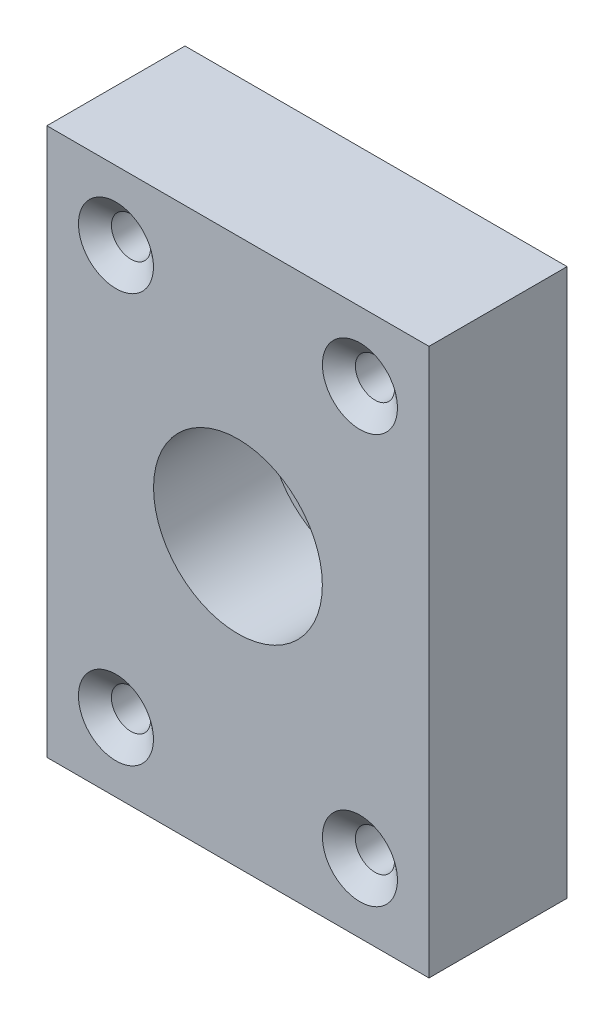
ISO-10303-21;
HEADER;
FILE_DESCRIPTION(('STEP AP214'),'2;1');
FILE_NAME('part.step','',(''),(''),'','','');
FILE_SCHEMA(('AUTOMOTIVE_DESIGN { 1 0 10303 214 1 1 1 1 }'));
ENDSEC;
DATA;
#1=APPLICATION_CONTEXT('core data for automotive mechanical design processes');
#2=APPLICATION_PROTOCOL_DEFINITION('international standard','automotive_design',2000,#1);
#3=PRODUCT_CONTEXT('',#1,'mechanical');
#4=PRODUCT('Part','Part','',(#3));
#5=PRODUCT_RELATED_PRODUCT_CATEGORY('part','',(#4));
#6=PRODUCT_DEFINITION_FORMATION('','',#4);
#7=PRODUCT_DEFINITION_CONTEXT('part definition',#1,'design');
#8=PRODUCT_DEFINITION('design','',#6,#7);
#9=PRODUCT_DEFINITION_SHAPE('','',#8);
#10=(LENGTH_UNIT() NAMED_UNIT(*) SI_UNIT(.MILLI.,.METRE.));
#11=(NAMED_UNIT(*) PLANE_ANGLE_UNIT() SI_UNIT($,.RADIAN.));
#12=(NAMED_UNIT(*) SI_UNIT($,.STERADIAN.) SOLID_ANGLE_UNIT());
#13=UNCERTAINTY_MEASURE_WITH_UNIT(LENGTH_MEASURE(1.E-05),#10,'distance_accuracy_value','');
#14=(GEOMETRIC_REPRESENTATION_CONTEXT(3) GLOBAL_UNCERTAINTY_ASSIGNED_CONTEXT((#13)) GLOBAL_UNIT_ASSIGNED_CONTEXT((#10,
#11,#12)) REPRESENTATION_CONTEXT('',''));
#15=CARTESIAN_POINT('',(0.,0.,0.));
#16=DIRECTION('',(0.,0.,1.));
#17=DIRECTION('',(1.,0.,0.));
#18=AXIS2_PLACEMENT_3D('',#15,#16,#17);
#19=CARTESIAN_POINT('',(0.,0.,18.));
#20=DIRECTION('',(1.,0.,0.));
#21=DIRECTION('',(0.,0.,-1.));
#22=AXIS2_PLACEMENT_3D('',#19,#20,#21);
#23=PLANE('',#22);
#24=DIRECTION('',(0.,-1.,0.));
#25=VECTOR('',#24,1.);
#26=CARTESIAN_POINT('',(0.,0.,0.));
#27=LINE('',#26,#25);
#28=CARTESIAN_POINT('',(0.,71.3,0.));
#29=VERTEX_POINT('',#28);
#30=CARTESIAN_POINT('',(0.,0.,0.));
#31=VERTEX_POINT('',#30);
#32=EDGE_CURVE('E96',#29,#31,#27,.T.);
#33=ORIENTED_EDGE('',*,*,#32,.T.);
#34=DIRECTION('',(0.,0.,-1.));
#35=VECTOR('',#34,1.);
#36=CARTESIAN_POINT('',(0.,0.,18.));
#37=LINE('',#36,#35);
#38=CARTESIAN_POINT('',(0.,0.,18.));
#39=VERTEX_POINT('',#38);
#40=EDGE_CURVE('E11',#39,#31,#37,.T.);
#41=ORIENTED_EDGE('',*,*,#40,.F.);
#42=DIRECTION('',(0.,-1.,0.));
#43=VECTOR('',#42,1.);
#44=CARTESIAN_POINT('',(0.,0.,18.));
#45=LINE('',#44,#43);
#46=CARTESIAN_POINT('',(0.,71.3,18.));
#47=VERTEX_POINT('',#46);
#48=EDGE_CURVE('E84',#47,#39,#45,.T.);
#49=ORIENTED_EDGE('',*,*,#48,.F.);
#50=DIRECTION('',(0.,0.,-1.));
#51=VECTOR('',#50,1.);
#52=CARTESIAN_POINT('',(0.,71.3,18.));
#53=LINE('',#52,#51);
#54=EDGE_CURVE('E92',#47,#29,#53,.T.);
#55=ORIENTED_EDGE('',*,*,#54,.T.);
#56=EDGE_LOOP('',(#33,#41,#49,#55));
#57=FACE_BOUND('',#56,.T.);
#58=ADVANCED_FACE('F33',(#57),#23,.F.);
#59=CARTESIAN_POINT('',(0.,0.,18.));
#60=DIRECTION('',(0.,1.,0.));
#61=DIRECTION('',(0.,0.,1.));
#62=AXIS2_PLACEMENT_3D('',#59,#60,#61);
#63=PLANE('',#62);
#64=DIRECTION('',(1.,0.,0.));
#65=VECTOR('',#64,1.);
#66=CARTESIAN_POINT('',(0.,0.,0.));
#67=LINE('',#66,#65);
#68=CARTESIAN_POINT('',(49.8,0.,0.));
#69=VERTEX_POINT('',#68);
#70=EDGE_CURVE('E88',#31,#69,#67,.T.);
#71=ORIENTED_EDGE('',*,*,#70,.T.);
#72=DIRECTION('',(0.,0.,-1.));
#73=VECTOR('',#72,1.);
#74=CARTESIAN_POINT('',(49.8,0.,18.));
#75=LINE('',#74,#73);
#76=CARTESIAN_POINT('',(49.8,0.,18.));
#77=VERTEX_POINT('',#76);
#78=EDGE_CURVE('E41',#77,#69,#75,.T.);
#79=ORIENTED_EDGE('',*,*,#78,.F.);
#80=DIRECTION('',(1.,0.,0.));
#81=VECTOR('',#80,1.);
#82=CARTESIAN_POINT('',(0.,0.,18.));
#83=LINE('',#82,#81);
#84=EDGE_CURVE('E79',#39,#77,#83,.T.);
#85=ORIENTED_EDGE('',*,*,#84,.F.);
#86=ORIENTED_EDGE('',*,*,#40,.T.);
#87=EDGE_LOOP('',(#71,#79,#85,#86));
#88=FACE_BOUND('',#87,.T.);
#89=ADVANCED_FACE('F87',(#88),#63,.F.);
#90=CARTESIAN_POINT('',(49.8,0.,18.));
#91=DIRECTION('',(-1.,0.,0.));
#92=DIRECTION('',(0.,0.,1.));
#93=AXIS2_PLACEMENT_3D('',#90,#91,#92);
#94=PLANE('',#93);
#95=DIRECTION('',(0.,1.,0.));
#96=VECTOR('',#95,1.);
#97=CARTESIAN_POINT('',(49.8,0.,0.));
#98=LINE('',#97,#96);
#99=CARTESIAN_POINT('',(49.8,71.3,0.));
#100=VERTEX_POINT('',#99);
#101=EDGE_CURVE('E66',#69,#100,#98,.T.);
#102=ORIENTED_EDGE('',*,*,#101,.T.);
#103=DIRECTION('',(0.,0.,-1.));
#104=VECTOR('',#103,1.);
#105=CARTESIAN_POINT('',(49.8,71.3,18.));
#106=LINE('',#105,#104);
#107=CARTESIAN_POINT('',(49.8,71.3,18.));
#108=VERTEX_POINT('',#107);
#109=EDGE_CURVE('E89',#108,#100,#106,.T.);
#110=ORIENTED_EDGE('',*,*,#109,.F.);
#111=DIRECTION('',(0.,1.,0.));
#112=VECTOR('',#111,1.);
#113=CARTESIAN_POINT('',(49.8,0.,18.));
#114=LINE('',#113,#112);
#115=EDGE_CURVE('E82',#77,#108,#114,.T.);
#116=ORIENTED_EDGE('',*,*,#115,.F.);
#117=ORIENTED_EDGE('',*,*,#78,.T.);
#118=EDGE_LOOP('',(#102,#110,#116,#117));
#119=FACE_BOUND('',#118,.T.);
#120=ADVANCED_FACE('F90',(#119),#94,.F.);
#121=CARTESIAN_POINT('',(0.,71.3,18.));
#122=DIRECTION('',(0.,-1.,0.));
#123=DIRECTION('',(0.,0.,-1.));
#124=AXIS2_PLACEMENT_3D('',#121,#122,#123);
#125=PLANE('',#124);
#126=DIRECTION('',(-1.,0.,0.));
#127=VECTOR('',#126,1.);
#128=CARTESIAN_POINT('',(0.,71.3,0.));
#129=LINE('',#128,#127);
#130=EDGE_CURVE('E72',#100,#29,#129,.T.);
#131=ORIENTED_EDGE('',*,*,#130,.T.);
#132=ORIENTED_EDGE('',*,*,#54,.F.);
#133=DIRECTION('',(-1.,0.,0.));
#134=VECTOR('',#133,1.);
#135=CARTESIAN_POINT('',(0.,71.3,18.));
#136=LINE('',#135,#134);
#137=EDGE_CURVE('E49',#108,#47,#136,.T.);
#138=ORIENTED_EDGE('',*,*,#137,.F.);
#139=ORIENTED_EDGE('',*,*,#109,.T.);
#140=EDGE_LOOP('',(#131,#132,#138,#139));
#141=FACE_BOUND('',#140,.T.);
#142=ADVANCED_FACE('F104',(#141),#125,.F.);
#143=CARTESIAN_POINT('',(0.,0.,18.));
#144=DIRECTION('',(0.,0.,-1.));
#145=DIRECTION('',(-1.,0.,0.));
#146=AXIS2_PLACEMENT_3D('',#143,#144,#145);
#147=PLANE('',#146);
#148=CARTESIAN_POINT('',(9.00000000000001,9.,18.));
#149=DIRECTION('',(0.,0.,1.));
#150=DIRECTION('',(1.,0.,0.));
#151=AXIS2_PLACEMENT_3D('',#148,#149,#150);
#152=CIRCLE('',#151,4.8895);
#153=CARTESIAN_POINT('',(13.8895,9.,18.));
#154=VERTEX_POINT('',#153);
#155=EDGE_CURVE('E154',#154,#154,#152,.T.);
#156=ORIENTED_EDGE('',*,*,#155,.F.);
#157=EDGE_LOOP('',(#156));
#158=FACE_BOUND('',#157,.T.);
#159=CARTESIAN_POINT('',(40.8,62.3,18.));
#160=DIRECTION('',(0.,0.,1.));
#161=DIRECTION('',(1.,0.,0.));
#162=AXIS2_PLACEMENT_3D('',#159,#160,#161);
#163=CIRCLE('',#162,4.8895);
#164=CARTESIAN_POINT('',(45.6895,62.3,18.));
#165=VERTEX_POINT('',#164);
#166=EDGE_CURVE('E145',#165,#165,#163,.T.);
#167=ORIENTED_EDGE('',*,*,#166,.F.);
#168=EDGE_LOOP('',(#167));
#169=FACE_BOUND('',#168,.T.);
#170=CARTESIAN_POINT('',(9.,62.3,18.));
#171=DIRECTION('',(0.,0.,1.));
#172=DIRECTION('',(1.,0.,0.));
#173=AXIS2_PLACEMENT_3D('',#170,#171,#172);
#174=CIRCLE('',#173,4.8895);
#175=CARTESIAN_POINT('',(13.8895,62.3,18.));
#176=VERTEX_POINT('',#175);
#177=EDGE_CURVE('E136',#176,#176,#174,.T.);
#178=ORIENTED_EDGE('',*,*,#177,.F.);
#179=EDGE_LOOP('',(#178));
#180=FACE_BOUND('',#179,.T.);
#181=CARTESIAN_POINT('',(40.8,8.99999999999999,18.));
#182=DIRECTION('',(0.,0.,1.));
#183=DIRECTION('',(1.,0.,0.));
#184=AXIS2_PLACEMENT_3D('',#181,#182,#183);
#185=CIRCLE('',#184,4.8895);
#186=CARTESIAN_POINT('',(45.6895,8.99999999999999,18.));
#187=VERTEX_POINT('',#186);
#188=EDGE_CURVE('E127',#187,#187,#185,.T.);
#189=ORIENTED_EDGE('',*,*,#188,.F.);
#190=EDGE_LOOP('',(#189));
#191=FACE_BOUND('',#190,.T.);
#192=CARTESIAN_POINT('',(24.9,37.4,18.));
#193=DIRECTION('',(0.,0.,1.));
#194=DIRECTION('',(1.,0.,0.));
#195=AXIS2_PLACEMENT_3D('',#192,#193,#194);
#196=CIRCLE('',#195,11.);
#197=CARTESIAN_POINT('',(35.9,37.4,18.));
#198=VERTEX_POINT('',#197);
#199=EDGE_CURVE('E110',#198,#198,#196,.T.);
#200=ORIENTED_EDGE('',*,*,#199,.F.);
#201=EDGE_LOOP('',(#200));
#202=FACE_BOUND('',#201,.T.);
#203=ORIENTED_EDGE('',*,*,#48,.T.);
#204=ORIENTED_EDGE('',*,*,#84,.T.);
#205=ORIENTED_EDGE('',*,*,#115,.T.);
#206=ORIENTED_EDGE('',*,*,#137,.T.);
#207=EDGE_LOOP('',(#203,#204,#205,#206));
#208=FACE_BOUND('',#207,.T.);
#209=ADVANCED_FACE('F80',(#158,#169,#180,#191,#202,#208),#147,.F.);
#210=CARTESIAN_POINT('',(0.,0.,0.));
#211=DIRECTION('',(0.,0.,-1.));
#212=DIRECTION('',(-1.,0.,0.));
#213=AXIS2_PLACEMENT_3D('',#210,#211,#212);
#214=PLANE('',#213);
#215=CARTESIAN_POINT('',(9.00000000000001,9.,0.));
#216=DIRECTION('',(0.,0.,1.));
#217=DIRECTION('',(1.,0.,0.));
#218=AXIS2_PLACEMENT_3D('',#215,#216,#217);
#219=CIRCLE('',#218,2.5527);
#220=CARTESIAN_POINT('',(11.5527,9.,0.));
#221=VERTEX_POINT('',#220);
#222=EDGE_CURVE('E148',#221,#221,#219,.T.);
#223=ORIENTED_EDGE('',*,*,#222,.T.);
#224=EDGE_LOOP('',(#223));
#225=FACE_BOUND('',#224,.T.);
#226=CARTESIAN_POINT('',(40.8,62.3,0.));
#227=DIRECTION('',(0.,0.,1.));
#228=DIRECTION('',(1.,0.,0.));
#229=AXIS2_PLACEMENT_3D('',#226,#227,#228);
#230=CIRCLE('',#229,2.5527);
#231=CARTESIAN_POINT('',(43.3527,62.3,0.));
#232=VERTEX_POINT('',#231);
#233=EDGE_CURVE('E139',#232,#232,#230,.T.);
#234=ORIENTED_EDGE('',*,*,#233,.T.);
#235=EDGE_LOOP('',(#234));
#236=FACE_BOUND('',#235,.T.);
#237=CARTESIAN_POINT('',(9.,62.3,0.));
#238=DIRECTION('',(0.,0.,1.));
#239=DIRECTION('',(1.,0.,0.));
#240=AXIS2_PLACEMENT_3D('',#237,#238,#239);
#241=CIRCLE('',#240,2.5527);
#242=CARTESIAN_POINT('',(11.5527,62.3,0.));
#243=VERTEX_POINT('',#242);
#244=EDGE_CURVE('E130',#243,#243,#241,.T.);
#245=ORIENTED_EDGE('',*,*,#244,.T.);
#246=EDGE_LOOP('',(#245));
#247=FACE_BOUND('',#246,.T.);
#248=CARTESIAN_POINT('',(40.8,8.99999999999999,0.));
#249=DIRECTION('',(0.,0.,1.));
#250=DIRECTION('',(1.,0.,0.));
#251=AXIS2_PLACEMENT_3D('',#248,#249,#250);
#252=CIRCLE('',#251,2.5527);
#253=CARTESIAN_POINT('',(43.3527,8.99999999999999,0.));
#254=VERTEX_POINT('',#253);
#255=EDGE_CURVE('E119',#254,#254,#252,.T.);
#256=ORIENTED_EDGE('',*,*,#255,.T.);
#257=EDGE_LOOP('',(#256));
#258=FACE_BOUND('',#257,.T.);
#259=CARTESIAN_POINT('',(24.9,37.4,0.));
#260=DIRECTION('',(0.,0.,1.));
#261=DIRECTION('',(1.,0.,0.));
#262=AXIS2_PLACEMENT_3D('',#259,#260,#261);
#263=CIRCLE('',#262,6.5);
#264=CARTESIAN_POINT('',(31.4,37.4,0.));
#265=VERTEX_POINT('',#264);
#266=EDGE_CURVE('E113',#265,#265,#263,.T.);
#267=ORIENTED_EDGE('',*,*,#266,.T.);
#268=EDGE_LOOP('',(#267));
#269=FACE_BOUND('',#268,.T.);
#270=ORIENTED_EDGE('',*,*,#32,.F.);
#271=ORIENTED_EDGE('',*,*,#130,.F.);
#272=ORIENTED_EDGE('',*,*,#101,.F.);
#273=ORIENTED_EDGE('',*,*,#70,.F.);
#274=EDGE_LOOP('',(#270,#271,#272,#273));
#275=FACE_BOUND('',#274,.T.);
#276=ADVANCED_FACE('F107',(#225,#236,#247,#258,#269,#275),#214,.T.);
#277=CARTESIAN_POINT('',(24.9,37.4,3.));
#278=DIRECTION('',(0.,0.,1.));
#279=DIRECTION('',(1.,0.,0.));
#280=AXIS2_PLACEMENT_3D('',#277,#278,#279);
#281=CYLINDRICAL_SURFACE('',#280,11.);
#282=CARTESIAN_POINT('',(24.9,37.4,3.));
#283=DIRECTION('',(0.,0.,1.));
#284=DIRECTION('',(1.,0.,0.));
#285=AXIS2_PLACEMENT_3D('',#282,#283,#284);
#286=CIRCLE('',#285,11.);
#287=CARTESIAN_POINT('',(35.9,37.4,3.));
#288=VERTEX_POINT('',#287);
#289=EDGE_CURVE('E99',#288,#288,#286,.T.);
#290=ORIENTED_EDGE('',*,*,#289,.F.);
#291=EDGE_LOOP('',(#290));
#292=FACE_BOUND('',#291,.T.);
#293=ORIENTED_EDGE('',*,*,#199,.T.);
#294=EDGE_LOOP('',(#293));
#295=FACE_BOUND('',#294,.T.);
#296=ADVANCED_FACE('F171',(#292,#295),#281,.F.);
#297=CARTESIAN_POINT('',(24.9,37.4,3.));
#298=DIRECTION('',(0.,0.,1.));
#299=DIRECTION('',(1.,0.,0.));
#300=AXIS2_PLACEMENT_3D('',#297,#298,#299);
#301=PLANE('',#300);
#302=CARTESIAN_POINT('',(24.9,37.4,3.));
#303=DIRECTION('',(0.,0.,1.));
#304=DIRECTION('',(1.,0.,0.));
#305=AXIS2_PLACEMENT_3D('',#302,#303,#304);
#306=CIRCLE('',#305,6.5);
#307=CARTESIAN_POINT('',(31.4,37.4,3.));
#308=VERTEX_POINT('',#307);
#309=EDGE_CURVE('E116',#308,#308,#306,.T.);
#310=ORIENTED_EDGE('',*,*,#309,.F.);
#311=EDGE_LOOP('',(#310));
#312=FACE_BOUND('',#311,.T.);
#313=ORIENTED_EDGE('',*,*,#289,.T.);
#314=EDGE_LOOP('',(#313));
#315=FACE_BOUND('',#314,.T.);
#316=ADVANCED_FACE('F173',(#312,#315),#301,.T.);
#317=CARTESIAN_POINT('',(24.9,37.4,0.));
#318=DIRECTION('',(0.,0.,1.));
#319=DIRECTION('',(1.,0.,0.));
#320=AXIS2_PLACEMENT_3D('',#317,#318,#319);
#321=CYLINDRICAL_SURFACE('',#320,6.5);
#322=ORIENTED_EDGE('',*,*,#266,.F.);
#323=EDGE_LOOP('',(#322));
#324=FACE_BOUND('',#323,.T.);
#325=ORIENTED_EDGE('',*,*,#309,.T.);
#326=EDGE_LOOP('',(#325));
#327=FACE_BOUND('',#326,.T.);
#328=ADVANCED_FACE('F180',(#324,#327),#321,.F.);
#329=CARTESIAN_POINT('',(40.8,8.99999999999999,18.));
#330=DIRECTION('',(0.,0.,1.));
#331=DIRECTION('',(1.,0.,0.));
#332=AXIS2_PLACEMENT_3D('',#329,#330,#331);
#333=CYLINDRICAL_SURFACE('',#332,2.5527);
#334=ORIENTED_EDGE('',*,*,#255,.F.);
#335=EDGE_LOOP('',(#334));
#336=FACE_BOUND('',#335,.T.);
#337=CARTESIAN_POINT('',(40.8,8.99999999999999,16.0391919818649));
#338=DIRECTION('',(0.,0.,1.));
#339=DIRECTION('',(1.,0.,0.));
#340=AXIS2_PLACEMENT_3D('',#337,#338,#339);
#341=CIRCLE('',#340,2.5527);
#342=CARTESIAN_POINT('',(43.3527,8.99999999999999,16.0391919818649));
#343=VERTEX_POINT('',#342);
#344=EDGE_CURVE('E124',#343,#343,#341,.T.);
#345=ORIENTED_EDGE('',*,*,#344,.T.);
#346=EDGE_LOOP('',(#345));
#347=FACE_BOUND('',#346,.T.);
#348=ADVANCED_FACE('F215',(#336,#347),#333,.F.);
#349=CARTESIAN_POINT('',(40.8,8.99999999999999,18.));
#350=DIRECTION('',(0.,0.,1.));
#351=DIRECTION('',(1.,0.,0.));
#352=AXIS2_PLACEMENT_3D('',#349,#350,#351);
#353=CONICAL_SURFACE('',#352,4.8895,0.872664625997164);
#354=ORIENTED_EDGE('',*,*,#344,.F.);
#355=EDGE_LOOP('',(#354));
#356=FACE_BOUND('',#355,.T.);
#357=ORIENTED_EDGE('',*,*,#188,.T.);
#358=EDGE_LOOP('',(#357));
#359=FACE_BOUND('',#358,.T.);
#360=ADVANCED_FACE('F220',(#356,#359),#353,.F.);
#361=CARTESIAN_POINT('',(9.,62.3,18.));
#362=DIRECTION('',(0.,0.,1.));
#363=DIRECTION('',(1.,0.,0.));
#364=AXIS2_PLACEMENT_3D('',#361,#362,#363);
#365=CYLINDRICAL_SURFACE('',#364,2.5527);
#366=ORIENTED_EDGE('',*,*,#244,.F.);
#367=EDGE_LOOP('',(#366));
#368=FACE_BOUND('',#367,.T.);
#369=CARTESIAN_POINT('',(9.,62.3,16.0391919818649));
#370=DIRECTION('',(0.,0.,1.));
#371=DIRECTION('',(1.,0.,0.));
#372=AXIS2_PLACEMENT_3D('',#369,#370,#371);
#373=CIRCLE('',#372,2.5527);
#374=CARTESIAN_POINT('',(11.5527,62.3,16.0391919818649));
#375=VERTEX_POINT('',#374);
#376=EDGE_CURVE('E133',#375,#375,#373,.T.);
#377=ORIENTED_EDGE('',*,*,#376,.T.);
#378=EDGE_LOOP('',(#377));
#379=FACE_BOUND('',#378,.T.);
#380=ADVANCED_FACE('F232',(#368,#379),#365,.F.);
#381=CARTESIAN_POINT('',(9.,62.3,18.));
#382=DIRECTION('',(0.,0.,1.));
#383=DIRECTION('',(1.,0.,0.));
#384=AXIS2_PLACEMENT_3D('',#381,#382,#383);
#385=CONICAL_SURFACE('',#384,4.8895,0.872664625997164);
#386=ORIENTED_EDGE('',*,*,#376,.F.);
#387=EDGE_LOOP('',(#386));
#388=FACE_BOUND('',#387,.T.);
#389=ORIENTED_EDGE('',*,*,#177,.T.);
#390=EDGE_LOOP('',(#389));
#391=FACE_BOUND('',#390,.T.);
#392=ADVANCED_FACE('F242',(#388,#391),#385,.F.);
#393=CARTESIAN_POINT('',(40.8,62.3,18.));
#394=DIRECTION('',(0.,0.,1.));
#395=DIRECTION('',(1.,0.,0.));
#396=AXIS2_PLACEMENT_3D('',#393,#394,#395);
#397=CYLINDRICAL_SURFACE('',#396,2.5527);
#398=ORIENTED_EDGE('',*,*,#233,.F.);
#399=EDGE_LOOP('',(#398));
#400=FACE_BOUND('',#399,.T.);
#401=CARTESIAN_POINT('',(40.8,62.3,16.0391919818649));
#402=DIRECTION('',(0.,0.,1.));
#403=DIRECTION('',(1.,0.,0.));
#404=AXIS2_PLACEMENT_3D('',#401,#402,#403);
#405=CIRCLE('',#404,2.5527);
#406=CARTESIAN_POINT('',(43.3527,62.3,16.0391919818649));
#407=VERTEX_POINT('',#406);
#408=EDGE_CURVE('E142',#407,#407,#405,.T.);
#409=ORIENTED_EDGE('',*,*,#408,.T.);
#410=EDGE_LOOP('',(#409));
#411=FACE_BOUND('',#410,.T.);
#412=ADVANCED_FACE('F252',(#400,#411),#397,.F.);
#413=CARTESIAN_POINT('',(40.8,62.3,18.));
#414=DIRECTION('',(0.,0.,1.));
#415=DIRECTION('',(1.,0.,0.));
#416=AXIS2_PLACEMENT_3D('',#413,#414,#415);
#417=CONICAL_SURFACE('',#416,4.8895,0.872664625997164);
#418=ORIENTED_EDGE('',*,*,#408,.F.);
#419=EDGE_LOOP('',(#418));
#420=FACE_BOUND('',#419,.T.);
#421=ORIENTED_EDGE('',*,*,#166,.T.);
#422=EDGE_LOOP('',(#421));
#423=FACE_BOUND('',#422,.T.);
#424=ADVANCED_FACE('F262',(#420,#423),#417,.F.);
#425=CARTESIAN_POINT('',(9.00000000000001,9.,18.));
#426=DIRECTION('',(0.,0.,1.));
#427=DIRECTION('',(1.,0.,0.));
#428=AXIS2_PLACEMENT_3D('',#425,#426,#427);
#429=CYLINDRICAL_SURFACE('',#428,2.5527);
#430=ORIENTED_EDGE('',*,*,#222,.F.);
#431=EDGE_LOOP('',(#430));
#432=FACE_BOUND('',#431,.T.);
#433=CARTESIAN_POINT('',(9.00000000000001,9.,16.0391919818649));
#434=DIRECTION('',(0.,0.,1.));
#435=DIRECTION('',(1.,0.,0.));
#436=AXIS2_PLACEMENT_3D('',#433,#434,#435);
#437=CIRCLE('',#436,2.5527);
#438=CARTESIAN_POINT('',(11.5527,9.,16.0391919818649));
#439=VERTEX_POINT('',#438);
#440=EDGE_CURVE('E151',#439,#439,#437,.T.);
#441=ORIENTED_EDGE('',*,*,#440,.T.);
#442=EDGE_LOOP('',(#441));
#443=FACE_BOUND('',#442,.T.);
#444=ADVANCED_FACE('F272',(#432,#443),#429,.F.);
#445=CARTESIAN_POINT('',(9.00000000000001,9.,18.));
#446=DIRECTION('',(0.,0.,1.));
#447=DIRECTION('',(1.,0.,0.));
#448=AXIS2_PLACEMENT_3D('',#445,#446,#447);
#449=CONICAL_SURFACE('',#448,4.8895,0.872664625997164);
#450=ORIENTED_EDGE('',*,*,#440,.F.);
#451=EDGE_LOOP('',(#450));
#452=FACE_BOUND('',#451,.T.);
#453=ORIENTED_EDGE('',*,*,#155,.T.);
#454=EDGE_LOOP('',(#453));
#455=FACE_BOUND('',#454,.T.);
#456=ADVANCED_FACE('F158',(#452,#455),#449,.F.);
#457=CLOSED_SHELL('',(#58,#89,#120,#142,#209,#276,#296,#316,#328,#348,#360,#380,#392,#412,#424,
#444,#456));
#458=MANIFOLD_SOLID_BREP('B2',#457);
#459=ADVANCED_BREP_SHAPE_REPRESENTATION('',(#18,#458),#14);
#460=SHAPE_DEFINITION_REPRESENTATION(#9,#459);
ENDSEC;
END-ISO-10303-21;
